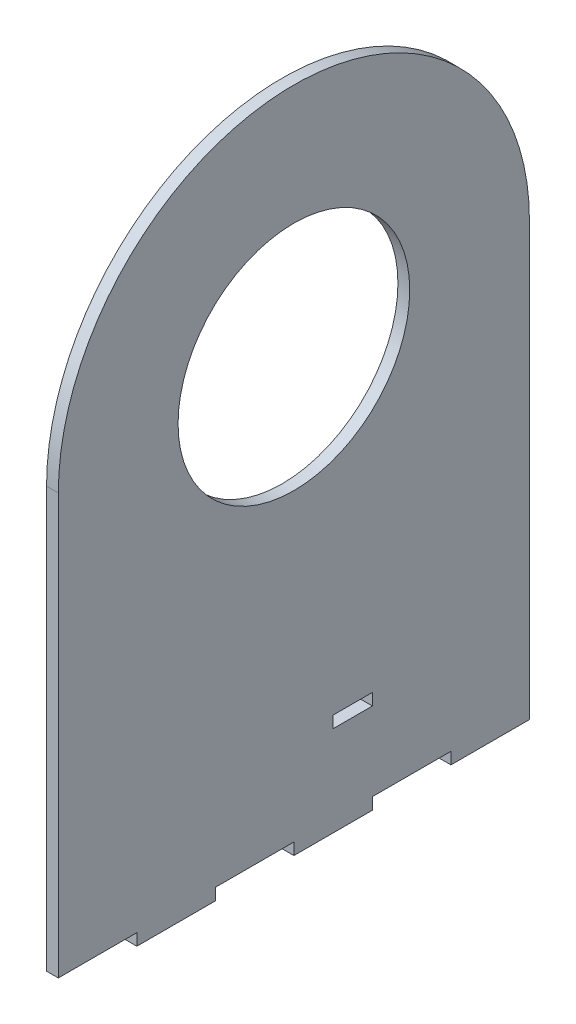
ISO-10303-21;
HEADER;
FILE_DESCRIPTION(('STEP AP214'),'2;1');
FILE_NAME('part.step','',(''),(''),'','','');
FILE_SCHEMA(('AUTOMOTIVE_DESIGN { 1 0 10303 214 1 1 1 1 }'));
ENDSEC;
DATA;
#1=APPLICATION_CONTEXT('core data for automotive mechanical design processes');
#2=APPLICATION_PROTOCOL_DEFINITION('international standard','automotive_design',2000,#1);
#3=PRODUCT_CONTEXT('',#1,'mechanical');
#4=PRODUCT('Part','Part','',(#3));
#5=PRODUCT_RELATED_PRODUCT_CATEGORY('part','',(#4));
#6=PRODUCT_DEFINITION_FORMATION('','',#4);
#7=PRODUCT_DEFINITION_CONTEXT('part definition',#1,'design');
#8=PRODUCT_DEFINITION('design','',#6,#7);
#9=PRODUCT_DEFINITION_SHAPE('','',#8);
#10=(LENGTH_UNIT() NAMED_UNIT(*) SI_UNIT(.MILLI.,.METRE.));
#11=(NAMED_UNIT(*) PLANE_ANGLE_UNIT() SI_UNIT($,.RADIAN.));
#12=(NAMED_UNIT(*) SI_UNIT($,.STERADIAN.) SOLID_ANGLE_UNIT());
#13=UNCERTAINTY_MEASURE_WITH_UNIT(LENGTH_MEASURE(1.E-05),#10,'distance_accuracy_value','');
#14=(GEOMETRIC_REPRESENTATION_CONTEXT(3) GLOBAL_UNCERTAINTY_ASSIGNED_CONTEXT((#13)) GLOBAL_UNIT_ASSIGNED_CONTEXT((#10,
#11,#12)) REPRESENTATION_CONTEXT('',''));
#15=CARTESIAN_POINT('',(0.,0.,0.));
#16=DIRECTION('',(0.,0.,1.));
#17=DIRECTION('',(1.,0.,0.));
#18=AXIS2_PLACEMENT_3D('',#15,#16,#17);
#19=CARTESIAN_POINT('',(3.,0.,-60.));
#20=DIRECTION('',(0.,0.,1.));
#21=DIRECTION('',(1.,0.,0.));
#22=AXIS2_PLACEMENT_3D('',#19,#20,#21);
#23=PLANE('',#22);
#24=DIRECTION('',(0.,1.,0.));
#25=VECTOR('',#24,1.);
#26=CARTESIAN_POINT('',(0.,0.,-60.));
#27=LINE('',#26,#25);
#28=CARTESIAN_POINT('',(0.,-85.,-60.));
#29=VERTEX_POINT('',#28);
#30=CARTESIAN_POINT('',(0.,25.,-60.));
#31=VERTEX_POINT('',#30);
#32=EDGE_CURVE('E210',#29,#31,#27,.T.);
#33=ORIENTED_EDGE('',*,*,#32,.T.);
#34=DIRECTION('',(-1.,0.,0.));
#35=VECTOR('',#34,1.);
#36=CARTESIAN_POINT('',(3.,25.,-60.));
#37=LINE('',#36,#35);
#38=CARTESIAN_POINT('',(3.,25.,-60.));
#39=VERTEX_POINT('',#38);
#40=EDGE_CURVE('E11',#39,#31,#37,.T.);
#41=ORIENTED_EDGE('',*,*,#40,.F.);
#42=DIRECTION('',(0.,1.,0.));
#43=VECTOR('',#42,1.);
#44=CARTESIAN_POINT('',(3.,0.,-60.));
#45=LINE('',#44,#43);
#46=CARTESIAN_POINT('',(3.,-85.,-60.));
#47=VERTEX_POINT('',#46);
#48=EDGE_CURVE('E399',#47,#39,#45,.T.);
#49=ORIENTED_EDGE('',*,*,#48,.F.);
#50=DIRECTION('',(-1.,0.,0.));
#51=VECTOR('',#50,1.);
#52=CARTESIAN_POINT('',(3.,-85.,-60.));
#53=LINE('',#52,#51);
#54=EDGE_CURVE('E239',#47,#29,#53,.T.);
#55=ORIENTED_EDGE('',*,*,#54,.T.);
#56=EDGE_LOOP('',(#33,#41,#49,#55));
#57=FACE_BOUND('',#56,.T.);
#58=ADVANCED_FACE('F34',(#57),#23,.F.);
#59=CARTESIAN_POINT('',(3.,25.,0.));
#60=DIRECTION('',(-1.,0.,0.));
#61=DIRECTION('',(0.,0.,1.));
#62=AXIS2_PLACEMENT_3D('',#59,#60,#61);
#63=CYLINDRICAL_SURFACE('',#62,60.);
#64=CARTESIAN_POINT('',(0.,25.,0.));
#65=DIRECTION('',(1.,0.,0.));
#66=DIRECTION('',(0.,0.,-1.));
#67=AXIS2_PLACEMENT_3D('',#64,#65,#66);
#68=CIRCLE('',#67,60.);
#69=CARTESIAN_POINT('',(0.,25.,60.));
#70=VERTEX_POINT('',#69);
#71=EDGE_CURVE('E213',#31,#70,#68,.T.);
#72=ORIENTED_EDGE('',*,*,#71,.T.);
#73=DIRECTION('',(-1.,0.,0.));
#74=VECTOR('',#73,1.);
#75=CARTESIAN_POINT('',(3.,25.,60.));
#76=LINE('',#75,#74);
#77=CARTESIAN_POINT('',(3.,25.,60.));
#78=VERTEX_POINT('',#77);
#79=EDGE_CURVE('E44',#78,#70,#76,.T.);
#80=ORIENTED_EDGE('',*,*,#79,.F.);
#81=CARTESIAN_POINT('',(3.,25.,0.));
#82=DIRECTION('',(1.,0.,0.));
#83=DIRECTION('',(0.,0.,-1.));
#84=AXIS2_PLACEMENT_3D('',#81,#82,#83);
#85=CIRCLE('',#84,60.);
#86=EDGE_CURVE('E400',#39,#78,#85,.T.);
#87=ORIENTED_EDGE('',*,*,#86,.F.);
#88=ORIENTED_EDGE('',*,*,#40,.T.);
#89=EDGE_LOOP('',(#72,#80,#87,#88));
#90=FACE_BOUND('',#89,.T.);
#91=ADVANCED_FACE('F300',(#90),#63,.T.);
#92=CARTESIAN_POINT('',(3.,0.,60.));
#93=DIRECTION('',(0.,0.,1.));
#94=DIRECTION('',(1.,0.,0.));
#95=AXIS2_PLACEMENT_3D('',#92,#93,#94);
#96=PLANE('',#95);
#97=DIRECTION('',(0.,1.,0.));
#98=VECTOR('',#97,1.);
#99=CARTESIAN_POINT('',(0.,0.,60.));
#100=LINE('',#99,#98);
#101=CARTESIAN_POINT('',(0.,-82.,60.));
#102=VERTEX_POINT('',#101);
#103=EDGE_CURVE('E216',#102,#70,#100,.T.);
#104=ORIENTED_EDGE('',*,*,#103,.F.);
#105=DIRECTION('',(-1.,0.,0.));
#106=VECTOR('',#105,1.);
#107=CARTESIAN_POINT('',(3.,-82.,60.));
#108=LINE('',#107,#106);
#109=CARTESIAN_POINT('',(3.,-82.,60.));
#110=VERTEX_POINT('',#109);
#111=EDGE_CURVE('E264',#110,#102,#108,.T.);
#112=ORIENTED_EDGE('',*,*,#111,.F.);
#113=DIRECTION('',(0.,1.,0.));
#114=VECTOR('',#113,1.);
#115=CARTESIAN_POINT('',(3.,0.,60.));
#116=LINE('',#115,#114);
#117=EDGE_CURVE('E381',#110,#78,#116,.T.);
#118=ORIENTED_EDGE('',*,*,#117,.T.);
#119=ORIENTED_EDGE('',*,*,#79,.T.);
#120=EDGE_LOOP('',(#104,#112,#118,#119));
#121=FACE_BOUND('',#120,.T.);
#122=ADVANCED_FACE('F306',(#121),#96,.T.);
#123=CARTESIAN_POINT('',(3.,-82.,0.));
#124=DIRECTION('',(0.,1.,0.));
#125=DIRECTION('',(0.,0.,1.));
#126=AXIS2_PLACEMENT_3D('',#123,#124,#125);
#127=PLANE('',#126);
#128=DIRECTION('',(0.,0.,-1.));
#129=VECTOR('',#128,1.);
#130=CARTESIAN_POINT('',(0.,-82.,0.));
#131=LINE('',#130,#129);
#132=CARTESIAN_POINT('',(0.,-82.,40.));
#133=VERTEX_POINT('',#132);
#134=EDGE_CURVE('E219',#102,#133,#131,.T.);
#135=ORIENTED_EDGE('',*,*,#134,.T.);
#136=DIRECTION('',(-1.,0.,0.));
#137=VECTOR('',#136,1.);
#138=CARTESIAN_POINT('',(3.,-82.,40.));
#139=LINE('',#138,#137);
#140=CARTESIAN_POINT('',(3.,-82.,40.));
#141=VERTEX_POINT('',#140);
#142=EDGE_CURVE('E261',#141,#133,#139,.T.);
#143=ORIENTED_EDGE('',*,*,#142,.F.);
#144=DIRECTION('',(0.,0.,-1.));
#145=VECTOR('',#144,1.);
#146=CARTESIAN_POINT('',(3.,-82.,0.));
#147=LINE('',#146,#145);
#148=EDGE_CURVE('E377',#110,#141,#147,.T.);
#149=ORIENTED_EDGE('',*,*,#148,.F.);
#150=ORIENTED_EDGE('',*,*,#111,.T.);
#151=EDGE_LOOP('',(#135,#143,#149,#150));
#152=FACE_BOUND('',#151,.T.);
#153=ADVANCED_FACE('F354',(#152),#127,.F.);
#154=CARTESIAN_POINT('',(3.,0.,40.));
#155=DIRECTION('',(0.,0.,-1.));
#156=DIRECTION('',(-1.,0.,0.));
#157=AXIS2_PLACEMENT_3D('',#154,#155,#156);
#158=PLANE('',#157);
#159=DIRECTION('',(0.,-1.,0.));
#160=VECTOR('',#159,1.);
#161=CARTESIAN_POINT('',(0.,0.,40.));
#162=LINE('',#161,#160);
#163=CARTESIAN_POINT('',(0.,-85.,40.));
#164=VERTEX_POINT('',#163);
#165=EDGE_CURVE('E221',#133,#164,#162,.T.);
#166=ORIENTED_EDGE('',*,*,#165,.T.);
#167=DIRECTION('',(-1.,0.,0.));
#168=VECTOR('',#167,1.);
#169=CARTESIAN_POINT('',(3.,-85.,40.));
#170=LINE('',#169,#168);
#171=CARTESIAN_POINT('',(3.,-85.,40.));
#172=VERTEX_POINT('',#171);
#173=EDGE_CURVE('E258',#172,#164,#170,.T.);
#174=ORIENTED_EDGE('',*,*,#173,.F.);
#175=DIRECTION('',(0.,-1.,0.));
#176=VECTOR('',#175,1.);
#177=CARTESIAN_POINT('',(3.,0.,40.));
#178=LINE('',#177,#176);
#179=EDGE_CURVE('E374',#141,#172,#178,.T.);
#180=ORIENTED_EDGE('',*,*,#179,.F.);
#181=ORIENTED_EDGE('',*,*,#142,.T.);
#182=EDGE_LOOP('',(#166,#174,#180,#181));
#183=FACE_BOUND('',#182,.T.);
#184=ADVANCED_FACE('F350',(#183),#158,.F.);
#185=CARTESIAN_POINT('',(3.,-85.,0.));
#186=DIRECTION('',(0.,1.,0.));
#187=DIRECTION('',(0.,0.,1.));
#188=AXIS2_PLACEMENT_3D('',#185,#186,#187);
#189=PLANE('',#188);
#190=DIRECTION('',(0.,0.,-1.));
#191=VECTOR('',#190,1.);
#192=CARTESIAN_POINT('',(0.,-85.,0.));
#193=LINE('',#192,#191);
#194=CARTESIAN_POINT('',(0.,-85.,20.));
#195=VERTEX_POINT('',#194);
#196=EDGE_CURVE('E223',#164,#195,#193,.T.);
#197=ORIENTED_EDGE('',*,*,#196,.T.);
#198=DIRECTION('',(-1.,0.,0.));
#199=VECTOR('',#198,1.);
#200=CARTESIAN_POINT('',(3.,-85.,20.));
#201=LINE('',#200,#199);
#202=CARTESIAN_POINT('',(3.,-85.,20.));
#203=VERTEX_POINT('',#202);
#204=EDGE_CURVE('E255',#203,#195,#201,.T.);
#205=ORIENTED_EDGE('',*,*,#204,.F.);
#206=DIRECTION('',(0.,0.,-1.));
#207=VECTOR('',#206,1.);
#208=CARTESIAN_POINT('',(3.,-85.,0.));
#209=LINE('',#208,#207);
#210=EDGE_CURVE('E376',#172,#203,#209,.T.);
#211=ORIENTED_EDGE('',*,*,#210,.F.);
#212=ORIENTED_EDGE('',*,*,#173,.T.);
#213=EDGE_LOOP('',(#197,#205,#211,#212));
#214=FACE_BOUND('',#213,.T.);
#215=ADVANCED_FACE('F346',(#214),#189,.F.);
#216=CARTESIAN_POINT('',(3.,0.,20.0000000000001));
#217=DIRECTION('',(0.,0.,1.));
#218=DIRECTION('',(0.,-1.,0.));
#219=AXIS2_PLACEMENT_3D('',#216,#217,#218);
#220=PLANE('',#219);
#221=DIRECTION('',(0.,1.,0.));
#222=VECTOR('',#221,1.);
#223=CARTESIAN_POINT('',(0.,0.,20.0000000000001));
#224=LINE('',#223,#222);
#225=CARTESIAN_POINT('',(0.,-82.,20.));
#226=VERTEX_POINT('',#225);
#227=EDGE_CURVE('E225',#195,#226,#224,.T.);
#228=ORIENTED_EDGE('',*,*,#227,.T.);
#229=DIRECTION('',(-1.,0.,0.));
#230=VECTOR('',#229,1.);
#231=CARTESIAN_POINT('',(3.,-82.,20.));
#232=LINE('',#231,#230);
#233=CARTESIAN_POINT('',(3.,-82.,20.));
#234=VERTEX_POINT('',#233);
#235=EDGE_CURVE('E252',#234,#226,#232,.T.);
#236=ORIENTED_EDGE('',*,*,#235,.F.);
#237=DIRECTION('',(0.,1.,0.));
#238=VECTOR('',#237,1.);
#239=CARTESIAN_POINT('',(3.,0.,20.0000000000001));
#240=LINE('',#239,#238);
#241=EDGE_CURVE('E379',#203,#234,#240,.T.);
#242=ORIENTED_EDGE('',*,*,#241,.F.);
#243=ORIENTED_EDGE('',*,*,#204,.T.);
#244=EDGE_LOOP('',(#228,#236,#242,#243));
#245=FACE_BOUND('',#244,.T.);
#246=ADVANCED_FACE('F342',(#245),#220,.F.);
#247=CARTESIAN_POINT('',(3.,-82.,0.));
#248=DIRECTION('',(0.,1.,0.));
#249=DIRECTION('',(0.,0.,1.));
#250=AXIS2_PLACEMENT_3D('',#247,#248,#249);
#251=PLANE('',#250);
#252=DIRECTION('',(0.,0.,-1.));
#253=VECTOR('',#252,1.);
#254=CARTESIAN_POINT('',(0.,-82.,0.));
#255=LINE('',#254,#253);
#256=CARTESIAN_POINT('',(0.,-82.,0.));
#257=VERTEX_POINT('',#256);
#258=EDGE_CURVE('E227',#226,#257,#255,.T.);
#259=ORIENTED_EDGE('',*,*,#258,.T.);
#260=DIRECTION('',(-1.,0.,0.));
#261=VECTOR('',#260,1.);
#262=CARTESIAN_POINT('',(3.,-82.,0.));
#263=LINE('',#262,#261);
#264=CARTESIAN_POINT('',(3.,-82.,0.));
#265=VERTEX_POINT('',#264);
#266=EDGE_CURVE('E249',#265,#257,#263,.T.);
#267=ORIENTED_EDGE('',*,*,#266,.F.);
#268=DIRECTION('',(0.,0.,-1.));
#269=VECTOR('',#268,1.);
#270=CARTESIAN_POINT('',(3.,-82.,0.));
#271=LINE('',#270,#269);
#272=EDGE_CURVE('E386',#234,#265,#271,.T.);
#273=ORIENTED_EDGE('',*,*,#272,.F.);
#274=ORIENTED_EDGE('',*,*,#235,.T.);
#275=EDGE_LOOP('',(#259,#267,#273,#274));
#276=FACE_BOUND('',#275,.T.);
#277=ADVANCED_FACE('F338',(#276),#251,.F.);
#278=CARTESIAN_POINT('',(3.,0.,0.));
#279=DIRECTION('',(0.,0.,-1.));
#280=DIRECTION('',(-1.,0.,0.));
#281=AXIS2_PLACEMENT_3D('',#278,#279,#280);
#282=PLANE('',#281);
#283=DIRECTION('',(0.,-1.,0.));
#284=VECTOR('',#283,1.);
#285=CARTESIAN_POINT('',(0.,0.,0.));
#286=LINE('',#285,#284);
#287=CARTESIAN_POINT('',(0.,-85.,0.));
#288=VERTEX_POINT('',#287);
#289=EDGE_CURVE('E229',#257,#288,#286,.T.);
#290=ORIENTED_EDGE('',*,*,#289,.T.);
#291=DIRECTION('',(-1.,0.,0.));
#292=VECTOR('',#291,1.);
#293=CARTESIAN_POINT('',(3.,-85.,0.));
#294=LINE('',#293,#292);
#295=CARTESIAN_POINT('',(3.,-85.,0.));
#296=VERTEX_POINT('',#295);
#297=EDGE_CURVE('E246',#296,#288,#294,.T.);
#298=ORIENTED_EDGE('',*,*,#297,.F.);
#299=DIRECTION('',(0.,-1.,0.));
#300=VECTOR('',#299,1.);
#301=CARTESIAN_POINT('',(3.,0.,0.));
#302=LINE('',#301,#300);
#303=EDGE_CURVE('E388',#265,#296,#302,.T.);
#304=ORIENTED_EDGE('',*,*,#303,.F.);
#305=ORIENTED_EDGE('',*,*,#266,.T.);
#306=EDGE_LOOP('',(#290,#298,#304,#305));
#307=FACE_BOUND('',#306,.T.);
#308=ADVANCED_FACE('F334',(#307),#282,.F.);
#309=CARTESIAN_POINT('',(3.,-85.,0.));
#310=DIRECTION('',(0.,1.,0.));
#311=DIRECTION('',(0.,0.,1.));
#312=AXIS2_PLACEMENT_3D('',#309,#310,#311);
#313=PLANE('',#312);
#314=DIRECTION('',(0.,0.,-1.));
#315=VECTOR('',#314,1.);
#316=CARTESIAN_POINT('',(0.,-85.,0.));
#317=LINE('',#316,#315);
#318=CARTESIAN_POINT('',(0.,-85.,-20.));
#319=VERTEX_POINT('',#318);
#320=EDGE_CURVE('E231',#288,#319,#317,.T.);
#321=ORIENTED_EDGE('',*,*,#320,.T.);
#322=DIRECTION('',(-1.,0.,0.));
#323=VECTOR('',#322,1.);
#324=CARTESIAN_POINT('',(3.,-85.,-20.));
#325=LINE('',#324,#323);
#326=CARTESIAN_POINT('',(3.,-85.,-20.));
#327=VERTEX_POINT('',#326);
#328=EDGE_CURVE('E243',#327,#319,#325,.T.);
#329=ORIENTED_EDGE('',*,*,#328,.F.);
#330=DIRECTION('',(0.,0.,-1.));
#331=VECTOR('',#330,1.);
#332=CARTESIAN_POINT('',(3.,-85.,0.));
#333=LINE('',#332,#331);
#334=EDGE_CURVE('E390',#296,#327,#333,.T.);
#335=ORIENTED_EDGE('',*,*,#334,.F.);
#336=ORIENTED_EDGE('',*,*,#297,.T.);
#337=EDGE_LOOP('',(#321,#329,#335,#336));
#338=FACE_BOUND('',#337,.T.);
#339=ADVANCED_FACE('F330',(#338),#313,.F.);
#340=CARTESIAN_POINT('',(3.,0.,-20.));
#341=DIRECTION('',(0.,0.,1.));
#342=DIRECTION('',(1.,0.,0.));
#343=AXIS2_PLACEMENT_3D('',#340,#341,#342);
#344=PLANE('',#343);
#345=DIRECTION('',(0.,1.,0.));
#346=VECTOR('',#345,1.);
#347=CARTESIAN_POINT('',(0.,0.,-20.));
#348=LINE('',#347,#346);
#349=CARTESIAN_POINT('',(0.,-82.,-20.));
#350=VERTEX_POINT('',#349);
#351=EDGE_CURVE('E233',#319,#350,#348,.T.);
#352=ORIENTED_EDGE('',*,*,#351,.T.);
#353=DIRECTION('',(-1.,0.,0.));
#354=VECTOR('',#353,1.);
#355=CARTESIAN_POINT('',(3.,-82.,-20.));
#356=LINE('',#355,#354);
#357=CARTESIAN_POINT('',(3.,-82.,-20.));
#358=VERTEX_POINT('',#357);
#359=EDGE_CURVE('E186',#358,#350,#356,.T.);
#360=ORIENTED_EDGE('',*,*,#359,.F.);
#361=DIRECTION('',(0.,1.,0.));
#362=VECTOR('',#361,1.);
#363=CARTESIAN_POINT('',(3.,0.,-20.));
#364=LINE('',#363,#362);
#365=EDGE_CURVE('E177',#327,#358,#364,.T.);
#366=ORIENTED_EDGE('',*,*,#365,.F.);
#367=ORIENTED_EDGE('',*,*,#328,.T.);
#368=EDGE_LOOP('',(#352,#360,#366,#367));
#369=FACE_BOUND('',#368,.T.);
#370=ADVANCED_FACE('F327',(#369),#344,.F.);
#371=CARTESIAN_POINT('',(3.,-82.,0.));
#372=DIRECTION('',(0.,1.,0.));
#373=DIRECTION('',(0.,0.,1.));
#374=AXIS2_PLACEMENT_3D('',#371,#372,#373);
#375=PLANE('',#374);
#376=DIRECTION('',(0.,0.,-1.));
#377=VECTOR('',#376,1.);
#378=CARTESIAN_POINT('',(0.,-82.,0.));
#379=LINE('',#378,#377);
#380=CARTESIAN_POINT('',(0.,-82.,-40.));
#381=VERTEX_POINT('',#380);
#382=EDGE_CURVE('E185',#350,#381,#379,.T.);
#383=ORIENTED_EDGE('',*,*,#382,.T.);
#384=DIRECTION('',(-1.,0.,0.));
#385=VECTOR('',#384,1.);
#386=CARTESIAN_POINT('',(3.,-82.,-40.));
#387=LINE('',#386,#385);
#388=CARTESIAN_POINT('',(3.,-82.,-40.));
#389=VERTEX_POINT('',#388);
#390=EDGE_CURVE('E182',#389,#381,#387,.T.);
#391=ORIENTED_EDGE('',*,*,#390,.F.);
#392=DIRECTION('',(0.,0.,-1.));
#393=VECTOR('',#392,1.);
#394=CARTESIAN_POINT('',(3.,-82.,0.));
#395=LINE('',#394,#393);
#396=EDGE_CURVE('E171',#358,#389,#395,.T.);
#397=ORIENTED_EDGE('',*,*,#396,.F.);
#398=ORIENTED_EDGE('',*,*,#359,.T.);
#399=EDGE_LOOP('',(#383,#391,#397,#398));
#400=FACE_BOUND('',#399,.T.);
#401=ADVANCED_FACE('F183',(#400),#375,.F.);
#402=CARTESIAN_POINT('',(3.,0.,-40.));
#403=DIRECTION('',(0.,0.,-1.));
#404=DIRECTION('',(-1.,0.,0.));
#405=AXIS2_PLACEMENT_3D('',#402,#403,#404);
#406=PLANE('',#405);
#407=DIRECTION('',(0.,-1.,0.));
#408=VECTOR('',#407,1.);
#409=CARTESIAN_POINT('',(0.,0.,-40.));
#410=LINE('',#409,#408);
#411=CARTESIAN_POINT('',(0.,-85.,-40.));
#412=VERTEX_POINT('',#411);
#413=EDGE_CURVE('E112',#381,#412,#410,.T.);
#414=ORIENTED_EDGE('',*,*,#413,.T.);
#415=DIRECTION('',(-1.,0.,0.));
#416=VECTOR('',#415,1.);
#417=CARTESIAN_POINT('',(3.,-85.,-40.));
#418=LINE('',#417,#416);
#419=CARTESIAN_POINT('',(3.,-85.,-40.));
#420=VERTEX_POINT('',#419);
#421=EDGE_CURVE('E187',#420,#412,#418,.T.);
#422=ORIENTED_EDGE('',*,*,#421,.F.);
#423=DIRECTION('',(0.,-1.,0.));
#424=VECTOR('',#423,1.);
#425=CARTESIAN_POINT('',(3.,0.,-40.));
#426=LINE('',#425,#424);
#427=EDGE_CURVE('E175',#389,#420,#426,.T.);
#428=ORIENTED_EDGE('',*,*,#427,.F.);
#429=ORIENTED_EDGE('',*,*,#390,.T.);
#430=EDGE_LOOP('',(#414,#422,#428,#429));
#431=FACE_BOUND('',#430,.T.);
#432=ADVANCED_FACE('F189',(#431),#406,.F.);
#433=CARTESIAN_POINT('',(3.,-62.,0.));
#434=DIRECTION('',(0.,-1.,0.));
#435=DIRECTION('',(0.,0.,-1.));
#436=AXIS2_PLACEMENT_3D('',#433,#434,#435);
#437=PLANE('',#436);
#438=DIRECTION('',(0.,0.,1.));
#439=VECTOR('',#438,1.);
#440=CARTESIAN_POINT('',(0.,-62.,0.));
#441=LINE('',#440,#439);
#442=CARTESIAN_POINT('',(0.,-62.,-20.));
#443=VERTEX_POINT('',#442);
#444=CARTESIAN_POINT('',(0.,-62.,-9.99999999999999));
#445=VERTEX_POINT('',#444);
#446=EDGE_CURVE('E195',#443,#445,#441,.T.);
#447=ORIENTED_EDGE('',*,*,#446,.T.);
#448=DIRECTION('',(-1.,0.,0.));
#449=VECTOR('',#448,1.);
#450=CARTESIAN_POINT('',(3.,-62.,-9.99999999999999));
#451=LINE('',#450,#449);
#452=CARTESIAN_POINT('',(3.,-62.,-9.99999999999999));
#453=VERTEX_POINT('',#452);
#454=EDGE_CURVE('E38',#453,#445,#451,.T.);
#455=ORIENTED_EDGE('',*,*,#454,.F.);
#456=DIRECTION('',(0.,0.,1.));
#457=VECTOR('',#456,1.);
#458=CARTESIAN_POINT('',(3.,-62.,0.));
#459=LINE('',#458,#457);
#460=CARTESIAN_POINT('',(3.,-62.,-20.));
#461=VERTEX_POINT('',#460);
#462=EDGE_CURVE('E238',#461,#453,#459,.T.);
#463=ORIENTED_EDGE('',*,*,#462,.F.);
#464=DIRECTION('',(-1.,0.,0.));
#465=VECTOR('',#464,1.);
#466=CARTESIAN_POINT('',(3.,-62.,-20.));
#467=LINE('',#466,#465);
#468=EDGE_CURVE('E191',#461,#443,#467,.T.);
#469=ORIENTED_EDGE('',*,*,#468,.T.);
#470=EDGE_LOOP('',(#447,#455,#463,#469));
#471=FACE_BOUND('',#470,.T.);
#472=ADVANCED_FACE('F36',(#471),#437,.F.);
#473=CARTESIAN_POINT('',(3.,0.,-9.99999999999999));
#474=DIRECTION('',(0.,0.,1.));
#475=DIRECTION('',(1.,0.,0.));
#476=AXIS2_PLACEMENT_3D('',#473,#474,#475);
#477=PLANE('',#476);
#478=DIRECTION('',(0.,1.,0.));
#479=VECTOR('',#478,1.);
#480=CARTESIAN_POINT('',(0.,0.,-9.99999999999999));
#481=LINE('',#480,#479);
#482=CARTESIAN_POINT('',(0.,-59.,-9.99999999999999));
#483=VERTEX_POINT('',#482);
#484=EDGE_CURVE('E198',#445,#483,#481,.T.);
#485=ORIENTED_EDGE('',*,*,#484,.T.);
#486=DIRECTION('',(-1.,0.,0.));
#487=VECTOR('',#486,1.);
#488=CARTESIAN_POINT('',(3.,-59.,-9.99999999999999));
#489=LINE('',#488,#487);
#490=CARTESIAN_POINT('',(3.,-59.,-9.99999999999999));
#491=VERTEX_POINT('',#490);
#492=EDGE_CURVE('E269',#491,#483,#489,.T.);
#493=ORIENTED_EDGE('',*,*,#492,.F.);
#494=DIRECTION('',(0.,1.,0.));
#495=VECTOR('',#494,1.);
#496=CARTESIAN_POINT('',(3.,0.,-9.99999999999999));
#497=LINE('',#496,#495);
#498=EDGE_CURVE('E127',#453,#491,#497,.T.);
#499=ORIENTED_EDGE('',*,*,#498,.F.);
#500=ORIENTED_EDGE('',*,*,#454,.T.);
#501=EDGE_LOOP('',(#485,#493,#499,#500));
#502=FACE_BOUND('',#501,.T.);
#503=ADVANCED_FACE('F274',(#502),#477,.F.);
#504=CARTESIAN_POINT('',(3.,-59.,0.));
#505=DIRECTION('',(0.,-1.,0.));
#506=DIRECTION('',(0.,0.,-1.));
#507=AXIS2_PLACEMENT_3D('',#504,#505,#506);
#508=PLANE('',#507);
#509=DIRECTION('',(0.,0.,1.));
#510=VECTOR('',#509,1.);
#511=CARTESIAN_POINT('',(0.,-59.,0.));
#512=LINE('',#511,#510);
#513=CARTESIAN_POINT('',(0.,-59.,-20.));
#514=VERTEX_POINT('',#513);
#515=EDGE_CURVE('E201',#514,#483,#512,.T.);
#516=ORIENTED_EDGE('',*,*,#515,.F.);
#517=DIRECTION('',(-1.,0.,0.));
#518=VECTOR('',#517,1.);
#519=CARTESIAN_POINT('',(3.,-59.,-20.));
#520=LINE('',#519,#518);
#521=CARTESIAN_POINT('',(3.,-59.,-20.));
#522=VERTEX_POINT('',#521);
#523=EDGE_CURVE('E268',#522,#514,#520,.T.);
#524=ORIENTED_EDGE('',*,*,#523,.F.);
#525=DIRECTION('',(0.,0.,1.));
#526=VECTOR('',#525,1.);
#527=CARTESIAN_POINT('',(3.,-59.,0.));
#528=LINE('',#527,#526);
#529=EDGE_CURVE('E409',#522,#491,#528,.T.);
#530=ORIENTED_EDGE('',*,*,#529,.T.);
#531=ORIENTED_EDGE('',*,*,#492,.T.);
#532=EDGE_LOOP('',(#516,#524,#530,#531));
#533=FACE_BOUND('',#532,.T.);
#534=ADVANCED_FACE('F288',(#533),#508,.T.);
#535=CARTESIAN_POINT('',(3.,25.,0.));
#536=DIRECTION('',(-1.,0.,0.));
#537=DIRECTION('',(0.,0.,1.));
#538=AXIS2_PLACEMENT_3D('',#535,#536,#537);
#539=CYLINDRICAL_SURFACE('',#538,29.5);
#540=CARTESIAN_POINT('',(3.,25.,0.));
#541=DIRECTION('',(1.,0.,0.));
#542=DIRECTION('',(0.,0.,-1.));
#543=AXIS2_PLACEMENT_3D('',#540,#541,#542);
#544=CIRCLE('',#543,29.5);
#545=CARTESIAN_POINT('',(3.,25.,-29.5));
#546=VERTEX_POINT('',#545);
#547=EDGE_CURVE('E401',#546,#546,#544,.T.);
#548=ORIENTED_EDGE('',*,*,#547,.T.);
#549=EDGE_LOOP('',(#548));
#550=FACE_BOUND('',#549,.T.);
#551=CARTESIAN_POINT('',(0.,25.,0.));
#552=DIRECTION('',(1.,0.,0.));
#553=DIRECTION('',(0.,0.,-1.));
#554=AXIS2_PLACEMENT_3D('',#551,#552,#553);
#555=CIRCLE('',#554,29.5);
#556=CARTESIAN_POINT('',(0.,25.,-29.5));
#557=VERTEX_POINT('',#556);
#558=EDGE_CURVE('E207',#557,#557,#555,.T.);
#559=ORIENTED_EDGE('',*,*,#558,.F.);
#560=EDGE_LOOP('',(#559));
#561=FACE_BOUND('',#560,.T.);
#562=ADVANCED_FACE('F290',(#550,#561),#539,.F.);
#563=CARTESIAN_POINT('',(3.,0.,-20.));
#564=DIRECTION('',(0.,0.,1.));
#565=DIRECTION('',(1.,0.,0.));
#566=AXIS2_PLACEMENT_3D('',#563,#564,#565);
#567=PLANE('',#566);
#568=DIRECTION('',(0.,1.,0.));
#569=VECTOR('',#568,1.);
#570=CARTESIAN_POINT('',(0.,0.,-20.));
#571=LINE('',#570,#569);
#572=EDGE_CURVE('E204',#443,#514,#571,.T.);
#573=ORIENTED_EDGE('',*,*,#572,.F.);
#574=ORIENTED_EDGE('',*,*,#468,.F.);
#575=DIRECTION('',(0.,1.,0.));
#576=VECTOR('',#575,1.);
#577=CARTESIAN_POINT('',(3.,0.,-20.));
#578=LINE('',#577,#576);
#579=EDGE_CURVE('E286',#461,#522,#578,.T.);
#580=ORIENTED_EDGE('',*,*,#579,.T.);
#581=ORIENTED_EDGE('',*,*,#523,.T.);
#582=EDGE_LOOP('',(#573,#574,#580,#581));
#583=FACE_BOUND('',#582,.T.);
#584=ADVANCED_FACE('F283',(#583),#567,.T.);
#585=CARTESIAN_POINT('',(3.,-85.,0.));
#586=DIRECTION('',(0.,1.,0.));
#587=DIRECTION('',(0.,0.,1.));
#588=AXIS2_PLACEMENT_3D('',#585,#586,#587);
#589=PLANE('',#588);
#590=DIRECTION('',(0.,0.,-1.));
#591=VECTOR('',#590,1.);
#592=CARTESIAN_POINT('',(0.,-85.,0.));
#593=LINE('',#592,#591);
#594=EDGE_CURVE('E118',#412,#29,#593,.T.);
#595=ORIENTED_EDGE('',*,*,#594,.T.);
#596=ORIENTED_EDGE('',*,*,#54,.F.);
#597=DIRECTION('',(0.,0.,-1.));
#598=VECTOR('',#597,1.);
#599=CARTESIAN_POINT('',(3.,-85.,0.));
#600=LINE('',#599,#598);
#601=EDGE_CURVE('E53',#420,#47,#600,.T.);
#602=ORIENTED_EDGE('',*,*,#601,.F.);
#603=ORIENTED_EDGE('',*,*,#421,.T.);
#604=EDGE_LOOP('',(#595,#596,#602,#603));
#605=FACE_BOUND('',#604,.T.);
#606=ADVANCED_FACE('F311',(#605),#589,.F.);
#607=CARTESIAN_POINT('',(3.,0.,0.));
#608=DIRECTION('',(1.,0.,0.));
#609=DIRECTION('',(0.,0.,-1.));
#610=AXIS2_PLACEMENT_3D('',#607,#608,#609);
#611=PLANE('',#610);
#612=ORIENTED_EDGE('',*,*,#462,.T.);
#613=ORIENTED_EDGE('',*,*,#498,.T.);
#614=ORIENTED_EDGE('',*,*,#529,.F.);
#615=ORIENTED_EDGE('',*,*,#579,.F.);
#616=EDGE_LOOP('',(#612,#613,#614,#615));
#617=FACE_BOUND('',#616,.T.);
#618=ORIENTED_EDGE('',*,*,#547,.F.);
#619=EDGE_LOOP('',(#618));
#620=FACE_BOUND('',#619,.T.);
#621=ORIENTED_EDGE('',*,*,#48,.T.);
#622=ORIENTED_EDGE('',*,*,#86,.T.);
#623=ORIENTED_EDGE('',*,*,#117,.F.);
#624=ORIENTED_EDGE('',*,*,#148,.T.);
#625=ORIENTED_EDGE('',*,*,#179,.T.);
#626=ORIENTED_EDGE('',*,*,#210,.T.);
#627=ORIENTED_EDGE('',*,*,#241,.T.);
#628=ORIENTED_EDGE('',*,*,#272,.T.);
#629=ORIENTED_EDGE('',*,*,#303,.T.);
#630=ORIENTED_EDGE('',*,*,#334,.T.);
#631=ORIENTED_EDGE('',*,*,#365,.T.);
#632=ORIENTED_EDGE('',*,*,#396,.T.);
#633=ORIENTED_EDGE('',*,*,#427,.T.);
#634=ORIENTED_EDGE('',*,*,#601,.T.);
#635=EDGE_LOOP('',(#621,#622,#623,#624,#625,#626,#627,#628,#629,#630,#631,#632,#633,#634));
#636=FACE_BOUND('',#635,.T.);
#637=ADVANCED_FACE('F173',(#617,#620,#636),#611,.T.);
#638=CARTESIAN_POINT('',(0.,0.,0.));
#639=DIRECTION('',(1.,0.,0.));
#640=DIRECTION('',(0.,0.,-1.));
#641=AXIS2_PLACEMENT_3D('',#638,#639,#640);
#642=PLANE('',#641);
#643=ORIENTED_EDGE('',*,*,#446,.F.);
#644=ORIENTED_EDGE('',*,*,#572,.T.);
#645=ORIENTED_EDGE('',*,*,#515,.T.);
#646=ORIENTED_EDGE('',*,*,#484,.F.);
#647=EDGE_LOOP('',(#643,#644,#645,#646));
#648=FACE_BOUND('',#647,.T.);
#649=ORIENTED_EDGE('',*,*,#558,.T.);
#650=EDGE_LOOP('',(#649));
#651=FACE_BOUND('',#650,.T.);
#652=ORIENTED_EDGE('',*,*,#32,.F.);
#653=ORIENTED_EDGE('',*,*,#594,.F.);
#654=ORIENTED_EDGE('',*,*,#413,.F.);
#655=ORIENTED_EDGE('',*,*,#382,.F.);
#656=ORIENTED_EDGE('',*,*,#351,.F.);
#657=ORIENTED_EDGE('',*,*,#320,.F.);
#658=ORIENTED_EDGE('',*,*,#289,.F.);
#659=ORIENTED_EDGE('',*,*,#258,.F.);
#660=ORIENTED_EDGE('',*,*,#227,.F.);
#661=ORIENTED_EDGE('',*,*,#196,.F.);
#662=ORIENTED_EDGE('',*,*,#165,.F.);
#663=ORIENTED_EDGE('',*,*,#134,.F.);
#664=ORIENTED_EDGE('',*,*,#103,.T.);
#665=ORIENTED_EDGE('',*,*,#71,.F.);
#666=EDGE_LOOP('',(#652,#653,#654,#655,#656,#657,#658,#659,#660,#661,#662,#663,#664,#665));
#667=FACE_BOUND('',#666,.T.);
#668=ADVANCED_FACE('F280',(#648,#651,#667),#642,.F.);
#669=CLOSED_SHELL('',(#58,#91,#122,#153,#184,#215,#246,#277,#308,#339,#370,#401,#432,#472,#503,
#534,#562,#584,#606,#637,#668));
#670=MANIFOLD_SOLID_BREP('B2',#669);
#671=ADVANCED_BREP_SHAPE_REPRESENTATION('',(#18,#670),#14);
#672=SHAPE_DEFINITION_REPRESENTATION(#9,#671);
ENDSEC;
END-ISO-10303-21;
